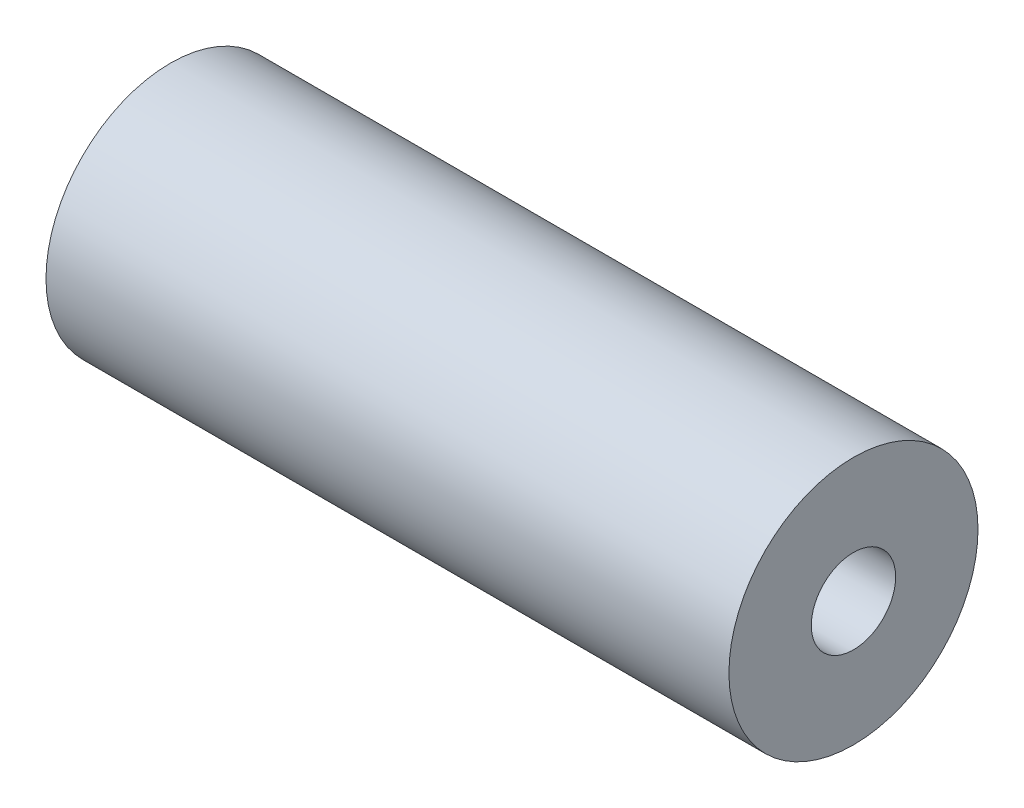
ISO-10303-21;
HEADER;
FILE_DESCRIPTION(('STEP AP214'),'2;1');
FILE_NAME('part.step','',(''),(''),'','','');
FILE_SCHEMA(('AUTOMOTIVE_DESIGN { 1 0 10303 214 1 1 1 1 }'));
ENDSEC;
DATA;
#1=APPLICATION_CONTEXT('core data for automotive mechanical design processes');
#2=APPLICATION_PROTOCOL_DEFINITION('international standard','automotive_design',2000,#1);
#3=PRODUCT_CONTEXT('',#1,'mechanical');
#4=PRODUCT('Part','Part','',(#3));
#5=PRODUCT_RELATED_PRODUCT_CATEGORY('part','',(#4));
#6=PRODUCT_DEFINITION_FORMATION('','',#4);
#7=PRODUCT_DEFINITION_CONTEXT('part definition',#1,'design');
#8=PRODUCT_DEFINITION('design','',#6,#7);
#9=PRODUCT_DEFINITION_SHAPE('','',#8);
#10=(LENGTH_UNIT() NAMED_UNIT(*) SI_UNIT(.MILLI.,.METRE.));
#11=(NAMED_UNIT(*) PLANE_ANGLE_UNIT() SI_UNIT($,.RADIAN.));
#12=(NAMED_UNIT(*) SI_UNIT($,.STERADIAN.) SOLID_ANGLE_UNIT());
#13=UNCERTAINTY_MEASURE_WITH_UNIT(LENGTH_MEASURE(1.E-05),#10,'distance_accuracy_value','');
#14=(GEOMETRIC_REPRESENTATION_CONTEXT(3) GLOBAL_UNCERTAINTY_ASSIGNED_CONTEXT((#13)) GLOBAL_UNIT_ASSIGNED_CONTEXT((#10,
#11,#12)) REPRESENTATION_CONTEXT('',''));
#15=CARTESIAN_POINT('',(0.,0.,0.));
#16=DIRECTION('',(0.,0.,1.));
#17=DIRECTION('',(1.,0.,0.));
#18=AXIS2_PLACEMENT_3D('',#15,#16,#17);
#19=CARTESIAN_POINT('',(170.,0.,0.));
#20=DIRECTION('',(-1.,0.,0.));
#21=DIRECTION('',(0.,0.,1.));
#22=AXIS2_PLACEMENT_3D('',#19,#20,#21);
#23=CYLINDRICAL_SURFACE('',#22,31.);
#24=DIRECTION('',(-1.,0.,0.));
#25=VECTOR('',#24,1.);
#26=CARTESIAN_POINT('',(170.,-30.5941170815567,5.));
#27=LINE('',#26,#25);
#28=CARTESIAN_POINT('',(25.,-30.5941170815567,5.));
#29=VERTEX_POINT('',#28);
#30=CARTESIAN_POINT('',(83.,-30.5941170815567,5.));
#31=VERTEX_POINT('',#30);
#32=EDGE_CURVE('E11',#29,#31,#27,.F.);
#33=ORIENTED_EDGE('',*,*,#32,.T.);
#34=CARTESIAN_POINT('',(83.,-30.5941170815567,5.));
#35=CARTESIAN_POINT('',(83.1396522558734,-30.5941071741538,5.00001612842654));
#36=CARTESIAN_POINT('',(83.2793009600637,-30.5950729461344,4.99414987062401));
#37=CARTESIAN_POINT('',(83.5575810930809,-30.5988840397781,4.97077002056007));
#38=CARTESIAN_POINT('',(83.6962126189883,-30.6017291796498,4.9532575548369));
#39=CARTESIAN_POINT('',(83.9713056099153,-30.6092225947377,4.90673143890542));
#40=CARTESIAN_POINT('',(84.1077695440122,-30.6138686382505,4.87773202250646));
#41=CARTESIAN_POINT('',(84.3777350960057,-30.6248261006454,4.80845745966161));
#42=CARTESIAN_POINT('',(84.5112367190193,-30.6311375166504,4.76818233269464));
#43=CARTESIAN_POINT('',(84.7743464730473,-30.6452450210902,4.67665451545295));
#44=CARTESIAN_POINT('',(84.9039544466453,-30.653041169458,4.62540138202717));
#45=CARTESIAN_POINT('',(85.1584202633789,-30.6698981622747,4.51227401809612));
#46=CARTESIAN_POINT('',(85.2832763301259,-30.6789594738789,4.45039586240544));
#47=CARTESIAN_POINT('',(85.5272851759284,-30.6980842966025,4.31650199254374));
#48=CARTESIAN_POINT('',(85.6464401134908,-30.7081474239066,4.24449015644547));
#49=CARTESIAN_POINT('',(85.8783321763252,-30.7290002056173,4.09078975178582));
#50=CARTESIAN_POINT('',(85.9910668930725,-30.7397901294087,4.00909758662821));
#51=CARTESIAN_POINT('',(86.2101605525618,-30.7618783120002,3.83595049095398));
#52=CARTESIAN_POINT('',(86.3164629632366,-30.7731798769397,3.74442444129199));
#53=CARTESIAN_POINT('',(86.5210367880178,-30.7958984241521,3.55273919634224));
#54=CARTESIAN_POINT('',(86.6193052144903,-30.8073154476036,3.45257681761761));
#55=CARTESIAN_POINT('',(86.8070701202042,-30.8299383086468,3.24435900328871));
#56=CARTESIAN_POINT('',(86.8965684692976,-30.8411441908421,3.13630525880012));
#57=CARTESIAN_POINT('',(87.0662251169312,-30.8630378529609,2.91298546869822));
#58=CARTESIAN_POINT('',(87.1463799591285,-30.8737254403087,2.79771677821926));
#59=CARTESIAN_POINT('',(87.2971362555281,-30.89433237188,2.56017781398533));
#60=CARTESIAN_POINT('',(87.3676857961783,-30.9042474264433,2.43787421057488));
#61=CARTESIAN_POINT('',(87.4982463027265,-30.9229694928127,2.1876255484355));
#62=CARTESIAN_POINT('',(87.5582533352148,-30.9317760907077,2.05967840628214));
#63=CARTESIAN_POINT('',(87.6672243163081,-30.9480222115328,1.79915070466793));
#64=CARTESIAN_POINT('',(87.7161934932441,-30.955462381392,1.66657237339253));
#65=CARTESIAN_POINT('',(87.8027703240675,-30.9687709376887,1.39762864005682));
#66=CARTESIAN_POINT('',(87.8403738378524,-30.9746387512853,1.26126187771009));
#67=CARTESIAN_POINT('',(87.9036156829223,-30.9845843869765,0.986997476265643));
#68=CARTESIAN_POINT('',(87.9293586312806,-30.9886778401677,0.849124652404992));
#69=CARTESIAN_POINT('',(87.9691941763295,-30.9950405680555,0.571668207031232));
#70=CARTESIAN_POINT('',(87.9832827246491,-30.9973092088623,0.432084008112663));
#71=CARTESIAN_POINT('',(88.0078075274266,-31.0012516355408,0.0122764438117));
#72=CARTESIAN_POINT('',(88.0005740372597,-31.0000733893785,-0.269310931648517));
#73=CARTESIAN_POINT('',(87.9546843911017,-30.9927218491337,-0.685954716283433));
#74=CARTESIAN_POINT('',(87.9337072543593,-30.9893660829688,-0.823318809281628));
#75=CARTESIAN_POINT('',(87.8804182036781,-30.9809256585637,-1.09578033561988));
#76=CARTESIAN_POINT('',(87.8481102287201,-30.9758416011547,-1.23087853957988));
#77=CARTESIAN_POINT('',(87.7723795716887,-30.9640794838408,-1.49788968331604));
#78=CARTESIAN_POINT('',(87.7289528558429,-30.9574008454968,-1.62980144803576));
#79=CARTESIAN_POINT('',(87.6313301481413,-30.9426387176189,-1.88944592761933));
#80=CARTESIAN_POINT('',(87.5771379661488,-30.9345557252079,-2.0171801023466));
#81=CARTESIAN_POINT('',(87.458087146784,-30.9171644836089,-2.26822624899323));
#82=CARTESIAN_POINT('',(87.3931796714044,-30.907850665269,-2.39151466872192));
#83=CARTESIAN_POINT('',(87.2533688539311,-30.8882883840228,-2.63214919359668));
#84=CARTESIAN_POINT('',(87.1784690746595,-30.8780402546618,-2.74949739628896));
#85=CARTESIAN_POINT('',(87.0191499156105,-30.8568846837756,-2.97754746937996));
#86=CARTESIAN_POINT('',(86.9347268653318,-30.8459769887943,-3.08824675175789));
#87=CARTESIAN_POINT('',(86.7569992501345,-30.8238101896404,-3.3021639836244));
#88=CARTESIAN_POINT('',(86.6636978572199,-30.8125512119311,-3.40538458201177));
#89=CARTESIAN_POINT('',(86.4676888419347,-30.7898568177399,-3.60484553899268));
#90=CARTESIAN_POINT('',(86.3648844694461,-30.7784208718382,-3.70099078808451));
#91=CARTESIAN_POINT('',(86.1515597123142,-30.7558301171178,-3.88425510301695));
#92=CARTESIAN_POINT('',(86.0410421425075,-30.74467520774,-3.97137743312738));
#93=CARTESIAN_POINT('',(85.812943509841,-30.7229516214796,-4.13607913416195));
#94=CARTESIAN_POINT('',(85.695357803399,-30.7123833389604,-4.21365212714727));
#95=CARTESIAN_POINT('',(85.4540496973847,-30.6921474190116,-4.35860559143728));
#96=CARTESIAN_POINT('',(85.3303296342819,-30.6824794426485,-4.42598990442832));
#97=CARTESIAN_POINT('',(85.0773260640176,-30.6643006578887,-4.5502326486069));
#98=CARTESIAN_POINT('',(84.9480320869567,-30.6557921642928,-4.60707010342665));
#99=CARTESIAN_POINT('',(84.6850741188298,-30.6402065689048,-4.70961059847246));
#100=CARTESIAN_POINT('',(84.5514118344641,-30.6331289156687,-4.75531792962886));
#101=CARTESIAN_POINT('',(84.2807748241907,-30.6206161228882,-4.83523569096362));
#102=CARTESIAN_POINT('',(84.1438037596333,-30.6151792502412,-4.86945825643488));
#103=CARTESIAN_POINT('',(83.8674558112168,-30.6061010782083,-4.92619562411105));
#104=CARTESIAN_POINT('',(83.7280801167089,-30.6024589160833,-4.94871605195974));
#105=CARTESIAN_POINT('',(83.4903811542104,-30.5978911593996,-4.97686586978178));
#106=CARTESIAN_POINT('',(83.3924176243321,-30.5964767966981,-4.98554586641818));
#107=CARTESIAN_POINT('',(83.1963058777745,-30.5945895087695,-4.99710932381166));
#108=CARTESIAN_POINT('',(83.098158250939,-30.5941150003154,-5.00000253275545));
#109=CARTESIAN_POINT('',(83.,-30.5941170815567,-5.));
#110=B_SPLINE_CURVE_WITH_KNOTS('',3,(#34,#35,#36,#37,#38,#39,#40,#41,#42,#43,#44,#45,#46,#47,
#48,#49,#50,#51,#52,#53,#54,#55,#56,#57,#58,#59,#60,#61,#62,#63,#64,#65,#66,#67,#68,#69,#70,#71,
#72,#73,#74,#75,#76,#77,#78,#79,#80,#81,#82,#83,#84,#85,#86,#87,#88,#89,#90,#91,#92,#93,#94,#95,
#96,#97,#98,#99,#100,#101,#102,#103,#104,#105,#106,#107,#108,#109),.UNSPECIFIED.,.F.,.F.,(4,2,2,
2,2,2,2,2,2,2,2,2,2,2,2,2,2,2,2,2,2,2,2,2,2,2,2,2,2,2,2,2,2,2,2,2,2,4),(0.,0.418825005902232,
0.837609504734256,1.25587669094738,1.67414315460394,2.09242650567747,2.51086471629068,
2.92914322747177,3.34757763456954,3.76927285908017,4.19112419466083,4.61288539149567,
5.03480211409566,5.45891558789914,5.88318696394561,6.30725694991344,6.731481223674,
7.15188836904748,7.57244148935725,8.41260740659341,8.82923045173311,9.24570880800171,
9.6623384732381,10.078820956426,10.4972569207358,10.9155440857049,11.3339930231952,
11.7522930169523,12.1754564133796,12.5984661809758,13.0217569585344,13.4448877323007,
13.8688512451272,14.2926510501282,14.7160016297662,15.1391485006318,15.4340557485135,
15.7284657878412),.UNSPECIFIED.);
#111=CARTESIAN_POINT('',(83.,-30.5941170815567,-5.));
#112=VERTEX_POINT('',#111);
#113=EDGE_CURVE('E63',#31,#112,#110,.T.);
#114=ORIENTED_EDGE('',*,*,#113,.T.);
#115=DIRECTION('',(-1.,0.,0.));
#116=VECTOR('',#115,1.);
#117=CARTESIAN_POINT('',(170.,-30.5941170815567,-5.));
#118=LINE('',#117,#116);
#119=CARTESIAN_POINT('',(25.,-30.5941170815567,-5.));
#120=VERTEX_POINT('',#119);
#121=EDGE_CURVE('E164',#112,#120,#118,.T.);
#122=ORIENTED_EDGE('',*,*,#121,.T.);
#123=CARTESIAN_POINT('',(25.,-30.5941170815567,-5.));
#124=CARTESIAN_POINT('',(24.8603477441266,-30.5941071741538,-5.00001612842654));
#125=CARTESIAN_POINT('',(24.7206990399363,-30.5950729461344,-4.99414987062401));
#126=CARTESIAN_POINT('',(24.4424189069191,-30.5988840397781,-4.97077002056007));
#127=CARTESIAN_POINT('',(24.3037873810117,-30.6017291796498,-4.9532575548369));
#128=CARTESIAN_POINT('',(24.0286943900847,-30.6092225947377,-4.90673143890542));
#129=CARTESIAN_POINT('',(23.8922304559878,-30.6138686382505,-4.87773202250646));
#130=CARTESIAN_POINT('',(23.6222649039943,-30.6248261006454,-4.80845745966162));
#131=CARTESIAN_POINT('',(23.4887632809807,-30.6311375166504,-4.76818233269464));
#132=CARTESIAN_POINT('',(23.2256535269527,-30.6452450210902,-4.67665451545295));
#133=CARTESIAN_POINT('',(23.0960455533547,-30.653041169458,-4.62540138202718));
#134=CARTESIAN_POINT('',(22.8415797366211,-30.6698981622747,-4.51227401809613));
#135=CARTESIAN_POINT('',(22.7167236698741,-30.6789594738789,-4.45039586240545));
#136=CARTESIAN_POINT('',(22.4727148240716,-30.6980842966025,-4.31650199254375));
#137=CARTESIAN_POINT('',(22.3535598865092,-30.7081474239066,-4.24449015644547));
#138=CARTESIAN_POINT('',(22.1216678236748,-30.7290002056173,-4.09078975178583));
#139=CARTESIAN_POINT('',(22.0089331069275,-30.7397901294087,-4.00909758662822));
#140=CARTESIAN_POINT('',(21.7898394474382,-30.7618783120002,-3.83595049095399));
#141=CARTESIAN_POINT('',(21.6835370367634,-30.7731798769397,-3.744424441292));
#142=CARTESIAN_POINT('',(21.4789632119822,-30.7958984241521,-3.55273919634223));
#143=CARTESIAN_POINT('',(21.3806947855097,-30.8073154476036,-3.45257681761761));
#144=CARTESIAN_POINT('',(21.1929298797958,-30.8299383086468,-3.24435900328872));
#145=CARTESIAN_POINT('',(21.1034315307024,-30.8411441908421,-3.13630525880012));
#146=CARTESIAN_POINT('',(20.9337748830688,-30.8630378529609,-2.91298546869822));
#147=CARTESIAN_POINT('',(20.8536200408715,-30.8737254403087,-2.79771677821926));
#148=CARTESIAN_POINT('',(20.7028637444719,-30.89433237188,-2.56017781398534));
#149=CARTESIAN_POINT('',(20.6323142038217,-30.9042474264433,-2.43787421057489));
#150=CARTESIAN_POINT('',(20.5017536972735,-30.9229694928127,-2.1876255484355));
#151=CARTESIAN_POINT('',(20.4417466647852,-30.9317760907077,-2.05967840628214));
#152=CARTESIAN_POINT('',(20.3327756836919,-30.9480222115328,-1.79915070466794));
#153=CARTESIAN_POINT('',(20.2838065067559,-30.955462381392,-1.66657237339254));
#154=CARTESIAN_POINT('',(20.1972296759325,-30.9687709376887,-1.39762864005684));
#155=CARTESIAN_POINT('',(20.1596261621476,-30.9746387512853,-1.26126187771011));
#156=CARTESIAN_POINT('',(20.0963843170777,-30.9845843869765,-0.98699747626566));
#157=CARTESIAN_POINT('',(20.0706413687194,-30.9886778401677,-0.849124652405009));
#158=CARTESIAN_POINT('',(20.0308058236705,-30.9950405680555,-0.571668207031248));
#159=CARTESIAN_POINT('',(20.0167172753509,-30.9973092088623,-0.43208400811268));
#160=CARTESIAN_POINT('',(19.9921924725734,-31.0012516355408,-0.012276443811718));
#161=CARTESIAN_POINT('',(19.9994259627403,-31.0000733893785,0.269310931648499));
#162=CARTESIAN_POINT('',(20.0453156088983,-30.9927218491337,0.685954716283416));
#163=CARTESIAN_POINT('',(20.0662927456407,-30.9893660829688,0.823318809281611));
#164=CARTESIAN_POINT('',(20.1195817963219,-30.9809256585637,1.09578033561987));
#165=CARTESIAN_POINT('',(20.1518897712799,-30.9758416011547,1.23087853957987));
#166=CARTESIAN_POINT('',(20.2276204283113,-30.9640794838408,1.49788968331603));
#167=CARTESIAN_POINT('',(20.2710471441571,-30.9574008454968,1.62980144803575));
#168=CARTESIAN_POINT('',(20.3686698518587,-30.9426387176189,1.88944592761932));
#169=CARTESIAN_POINT('',(20.4228620338512,-30.9345557252079,2.01718010234659));
#170=CARTESIAN_POINT('',(20.541912853216,-30.9171644836089,2.26822624899321));
#171=CARTESIAN_POINT('',(20.6068203285956,-30.907850665269,2.3915146687219));
#172=CARTESIAN_POINT('',(20.7466311460689,-30.8882883840229,2.63214919359666));
#173=CARTESIAN_POINT('',(20.8215309253405,-30.8780402546618,2.74949739628894));
#174=CARTESIAN_POINT('',(20.9808500843895,-30.8568846837756,2.97754746937994));
#175=CARTESIAN_POINT('',(21.0652731346682,-30.8459769887943,3.08824675175786));
#176=CARTESIAN_POINT('',(21.2430007498654,-30.8238101896404,3.30216398362437));
#177=CARTESIAN_POINT('',(21.3363021427801,-30.8125512119311,3.40538458201175));
#178=CARTESIAN_POINT('',(21.5323111580653,-30.7898568177399,3.60484553899267));
#179=CARTESIAN_POINT('',(21.6351155305539,-30.7784208718382,3.7009907880845));
#180=CARTESIAN_POINT('',(21.8484402876858,-30.7558301171178,3.88425510301694));
#181=CARTESIAN_POINT('',(21.9589578574925,-30.74467520774,3.97137743312737));
#182=CARTESIAN_POINT('',(22.1870564901589,-30.7229516214796,4.13607913416194));
#183=CARTESIAN_POINT('',(22.304642196601,-30.7123833389604,4.21365212714726));
#184=CARTESIAN_POINT('',(22.5459503026152,-30.6921474190116,4.35860559143728));
#185=CARTESIAN_POINT('',(22.669670365718,-30.6824794426485,4.42598990442831));
#186=CARTESIAN_POINT('',(22.9226739359823,-30.6643006578887,4.55023264860689));
#187=CARTESIAN_POINT('',(23.0519679130433,-30.6557921642928,4.60707010342664));
#188=CARTESIAN_POINT('',(23.3149258811702,-30.6402065689048,4.70961059847245));
#189=CARTESIAN_POINT('',(23.4485881655359,-30.6331289156687,4.75531792962885));
#190=CARTESIAN_POINT('',(23.7192251758093,-30.6206161228882,4.83523569096361));
#191=CARTESIAN_POINT('',(23.8561962403666,-30.6151792502412,4.86945825643487));
#192=CARTESIAN_POINT('',(24.1325441887831,-30.6061010782083,4.92619562411105));
#193=CARTESIAN_POINT('',(24.271919883291,-30.6024589160833,4.94871605195974));
#194=CARTESIAN_POINT('',(24.5096188457896,-30.5978911593996,4.97686586978178));
#195=CARTESIAN_POINT('',(24.6075823756679,-30.5964767966981,4.98554586641818));
#196=CARTESIAN_POINT('',(24.8036941222255,-30.5945895087695,4.99710932381167));
#197=CARTESIAN_POINT('',(24.901841749061,-30.5941150003153,5.00000253275545));
#198=CARTESIAN_POINT('',(25.,-30.5941170815567,5.));
#199=B_SPLINE_CURVE_WITH_KNOTS('',3,(#123,#124,#125,#126,#127,#128,#129,#130,#131,#132,#133,
#134,#135,#136,#137,#138,#139,#140,#141,#142,#143,#144,#145,#146,#147,#148,#149,#150,#151,#152,
#153,#154,#155,#156,#157,#158,#159,#160,#161,#162,#163,#164,#165,#166,#167,#168,#169,#170,#171,
#172,#173,#174,#175,#176,#177,#178,#179,#180,#181,#182,#183,#184,#185,#186,#187,#188,#189,#190,
#191,#192,#193,#194,#195,#196,#197,#198),.UNSPECIFIED.,.F.,.F.,(4,2,2,2,2,2,2,2,2,2,2,2,2,2,2,2,
2,2,2,2,2,2,2,2,2,2,2,2,2,2,2,2,2,2,2,2,2,4),(0.,0.418825005902225,0.837609504734256,
1.25587669094738,1.67414315460394,2.09242650567748,2.51086471629068,2.92914322747178,
3.34757763456954,3.76927285908018,4.19112419466084,4.61288539149568,5.03480211409567,
5.45891558789915,5.88318696394561,6.30725694991344,6.731481223674,7.15188836904748,
7.57244148935725,8.41260740659341,8.8292304517331,9.24570880800171,9.6623384732381,
10.078820956426,10.4972569207358,10.9155440857049,11.3339930231952,11.7522930169523,
12.1754564133796,12.5984661809758,13.0217569585344,13.4448877323007,13.8688512451272,
14.2926510501281,14.7160016297662,15.1391485006318,15.4340557485135,15.7284657878412),.UNSPECIFIED.);
#200=EDGE_CURVE('E56',#120,#29,#199,.T.);
#201=ORIENTED_EDGE('',*,*,#200,.T.);
#202=EDGE_LOOP('',(#33,#114,#122,#201));
#203=FACE_BOUND('',#202,.T.);
#204=CARTESIAN_POINT('',(170.,0.,0.));
#205=DIRECTION('',(1.,0.,0.));
#206=DIRECTION('',(0.,0.,-1.));
#207=AXIS2_PLACEMENT_3D('',#204,#205,#206);
#208=CIRCLE('',#207,31.);
#209=CARTESIAN_POINT('',(170.,0.,-31.));
#210=VERTEX_POINT('',#209);
#211=EDGE_CURVE('E150',#210,#210,#208,.T.);
#212=ORIENTED_EDGE('',*,*,#211,.F.);
#213=EDGE_LOOP('',(#212));
#214=FACE_BOUND('',#213,.T.);
#215=CARTESIAN_POINT('',(0.,0.,0.));
#216=DIRECTION('',(1.,0.,0.));
#217=DIRECTION('',(0.,0.,-1.));
#218=AXIS2_PLACEMENT_3D('',#215,#216,#217);
#219=CIRCLE('',#218,31.);
#220=CARTESIAN_POINT('',(0.,0.,-31.));
#221=VERTEX_POINT('',#220);
#222=EDGE_CURVE('E149',#221,#221,#219,.T.);
#223=ORIENTED_EDGE('',*,*,#222,.T.);
#224=EDGE_LOOP('',(#223));
#225=FACE_BOUND('',#224,.T.);
#226=ADVANCED_FACE('F47',(#203,#214,#225),#23,.T.);
#227=CARTESIAN_POINT('',(170.,0.,0.));
#228=DIRECTION('',(1.,0.,0.));
#229=DIRECTION('',(0.,0.,-1.));
#230=AXIS2_PLACEMENT_3D('',#227,#228,#229);
#231=PLANE('',#230);
#232=CARTESIAN_POINT('',(170.,0.,0.));
#233=DIRECTION('',(1.,0.,0.));
#234=DIRECTION('',(0.,0.,-1.));
#235=AXIS2_PLACEMENT_3D('',#232,#233,#234);
#236=CIRCLE('',#235,10.5);
#237=CARTESIAN_POINT('',(170.,0.,-10.5));
#238=VERTEX_POINT('',#237);
#239=EDGE_CURVE('E145',#238,#238,#236,.T.);
#240=ORIENTED_EDGE('',*,*,#239,.F.);
#241=EDGE_LOOP('',(#240));
#242=FACE_BOUND('',#241,.T.);
#243=ORIENTED_EDGE('',*,*,#211,.T.);
#244=EDGE_LOOP('',(#243));
#245=FACE_BOUND('',#244,.T.);
#246=ADVANCED_FACE('F193',(#242,#245),#231,.T.);
#247=CARTESIAN_POINT('',(0.,0.,0.));
#248=DIRECTION('',(1.,0.,0.));
#249=DIRECTION('',(0.,0.,-1.));
#250=AXIS2_PLACEMENT_3D('',#247,#248,#249);
#251=PLANE('',#250);
#252=CARTESIAN_POINT('',(0.,0.,0.));
#253=DIRECTION('',(-1.,0.,0.));
#254=DIRECTION('',(0.,0.,1.));
#255=AXIS2_PLACEMENT_3D('',#252,#253,#254);
#256=CIRCLE('',#255,13.8);
#257=CARTESIAN_POINT('',(0.,0.,13.8));
#258=VERTEX_POINT('',#257);
#259=EDGE_CURVE('E120',#258,#258,#256,.T.);
#260=ORIENTED_EDGE('',*,*,#259,.F.);
#261=EDGE_LOOP('',(#260));
#262=FACE_BOUND('',#261,.T.);
#263=ORIENTED_EDGE('',*,*,#222,.F.);
#264=EDGE_LOOP('',(#263));
#265=FACE_BOUND('',#264,.T.);
#266=ADVANCED_FACE('F198',(#262,#265),#251,.F.);
#267=CARTESIAN_POINT('',(170.,0.,0.));
#268=DIRECTION('',(1.,0.,0.));
#269=DIRECTION('',(0.,0.,-1.));
#270=AXIS2_PLACEMENT_3D('',#267,#268,#269);
#271=CYLINDRICAL_SURFACE('',#270,10.5);
#272=CARTESIAN_POINT('',(130.,0.,0.));
#273=DIRECTION('',(1.,0.,0.));
#274=DIRECTION('',(0.,0.,-1.));
#275=AXIS2_PLACEMENT_3D('',#272,#273,#274);
#276=CIRCLE('',#275,10.5);
#277=CARTESIAN_POINT('',(130.,0.,-10.5));
#278=VERTEX_POINT('',#277);
#279=EDGE_CURVE('E138',#278,#278,#276,.F.);
#280=ORIENTED_EDGE('',*,*,#279,.T.);
#281=EDGE_LOOP('',(#280));
#282=FACE_BOUND('',#281,.T.);
#283=ORIENTED_EDGE('',*,*,#239,.T.);
#284=EDGE_LOOP('',(#283));
#285=FACE_BOUND('',#284,.T.);
#286=ADVANCED_FACE('F205',(#282,#285),#271,.F.);
#287=CARTESIAN_POINT('',(130.,0.,0.));
#288=DIRECTION('',(1.,0.,0.));
#289=DIRECTION('',(0.,0.,-1.));
#290=AXIS2_PLACEMENT_3D('',#287,#288,#289);
#291=PLANE('',#290);
#292=CARTESIAN_POINT('',(130.,0.,0.));
#293=DIRECTION('',(1.,0.,0.));
#294=DIRECTION('',(0.,0.,-1.));
#295=AXIS2_PLACEMENT_3D('',#292,#293,#294);
#296=CIRCLE('',#295,15.);
#297=CARTESIAN_POINT('',(130.,0.,-15.));
#298=VERTEX_POINT('',#297);
#299=EDGE_CURVE('E133',#298,#298,#296,.T.);
#300=ORIENTED_EDGE('',*,*,#299,.F.);
#301=EDGE_LOOP('',(#300));
#302=FACE_BOUND('',#301,.T.);
#303=ORIENTED_EDGE('',*,*,#279,.F.);
#304=EDGE_LOOP('',(#303));
#305=FACE_BOUND('',#304,.T.);
#306=ADVANCED_FACE('F212',(#302,#305),#291,.F.);
#307=CARTESIAN_POINT('',(76.,0.,0.));
#308=DIRECTION('',(1.,0.,0.));
#309=DIRECTION('',(0.,0.,-1.));
#310=AXIS2_PLACEMENT_3D('',#307,#308,#309);
#311=CYLINDRICAL_SURFACE('',#310,15.);
#312=CARTESIAN_POINT('',(76.,0.,0.));
#313=DIRECTION('',(1.,0.,0.));
#314=DIRECTION('',(0.,0.,-1.));
#315=AXIS2_PLACEMENT_3D('',#312,#313,#314);
#316=CIRCLE('',#315,15.);
#317=CARTESIAN_POINT('',(76.,0.,-15.));
#318=VERTEX_POINT('',#317);
#319=EDGE_CURVE('E134',#318,#318,#316,.T.);
#320=ORIENTED_EDGE('',*,*,#319,.F.);
#321=EDGE_LOOP('',(#320));
#322=FACE_BOUND('',#321,.T.);
#323=ORIENTED_EDGE('',*,*,#299,.T.);
#324=EDGE_LOOP('',(#323));
#325=FACE_BOUND('',#324,.T.);
#326=ADVANCED_FACE('F214',(#322,#325),#311,.F.);
#327=CARTESIAN_POINT('',(76.,0.,0.));
#328=DIRECTION('',(1.,0.,0.));
#329=DIRECTION('',(0.,0.,-1.));
#330=AXIS2_PLACEMENT_3D('',#327,#328,#329);
#331=PLANE('',#330);
#332=CARTESIAN_POINT('',(76.,0.,0.));
#333=DIRECTION('',(-1.,0.,0.));
#334=DIRECTION('',(0.,0.,1.));
#335=AXIS2_PLACEMENT_3D('',#332,#333,#334);
#336=CIRCLE('',#335,10.);
#337=CARTESIAN_POINT('',(76.,0.,10.));
#338=VERTEX_POINT('',#337);
#339=EDGE_CURVE('E129',#338,#338,#336,.T.);
#340=ORIENTED_EDGE('',*,*,#339,.T.);
#341=EDGE_LOOP('',(#340));
#342=FACE_BOUND('',#341,.T.);
#343=ORIENTED_EDGE('',*,*,#319,.T.);
#344=EDGE_LOOP('',(#343));
#345=FACE_BOUND('',#344,.T.);
#346=ADVANCED_FACE('F217',(#342,#345),#331,.T.);
#347=CARTESIAN_POINT('',(76.,0.,0.));
#348=DIRECTION('',(-1.,0.,0.));
#349=DIRECTION('',(0.,0.,1.));
#350=AXIS2_PLACEMENT_3D('',#347,#348,#349);
#351=CONICAL_SURFACE('',#350,10.,0.0499583957219426);
#352=ORIENTED_EDGE('',*,*,#259,.T.);
#353=EDGE_LOOP('',(#352));
#354=FACE_BOUND('',#353,.T.);
#355=ORIENTED_EDGE('',*,*,#339,.F.);
#356=EDGE_LOOP('',(#355));
#357=FACE_BOUND('',#356,.T.);
#358=ADVANCED_FACE('F177',(#354,#357),#351,.F.);
#359=CARTESIAN_POINT('',(25.,-31.,0.));
#360=DIRECTION('',(0.,1.,0.));
#361=DIRECTION('',(0.,0.,1.));
#362=AXIS2_PLACEMENT_3D('',#359,#360,#361);
#363=CYLINDRICAL_SURFACE('',#362,5.);
#364=DIRECTION('',(0.,1.,0.));
#365=VECTOR('',#364,1.);
#366=CARTESIAN_POINT('',(25.,-31.,-5.));
#367=LINE('',#366,#365);
#368=CARTESIAN_POINT('',(25.,-25.,-5.));
#369=VERTEX_POINT('',#368);
#370=EDGE_CURVE('E110',#120,#369,#367,.T.);
#371=ORIENTED_EDGE('',*,*,#370,.T.);
#372=CARTESIAN_POINT('',(25.,-25.,0.));
#373=DIRECTION('',(0.,1.,0.));
#374=DIRECTION('',(0.,0.,1.));
#375=AXIS2_PLACEMENT_3D('',#372,#373,#374);
#376=CIRCLE('',#375,5.);
#377=CARTESIAN_POINT('',(25.,-25.,5.));
#378=VERTEX_POINT('',#377);
#379=EDGE_CURVE('E103',#369,#378,#376,.T.);
#380=ORIENTED_EDGE('',*,*,#379,.T.);
#381=DIRECTION('',(0.,1.,0.));
#382=VECTOR('',#381,1.);
#383=CARTESIAN_POINT('',(25.,-31.,5.));
#384=LINE('',#383,#382);
#385=EDGE_CURVE('E89',#29,#378,#384,.T.);
#386=ORIENTED_EDGE('',*,*,#385,.F.);
#387=ORIENTED_EDGE('',*,*,#200,.F.);
#388=EDGE_LOOP('',(#371,#380,#386,#387));
#389=FACE_BOUND('',#388,.T.);
#390=ADVANCED_FACE('F109',(#389),#363,.F.);
#391=CARTESIAN_POINT('',(25.,-31.,-5.));
#392=DIRECTION('',(0.,0.,-1.));
#393=DIRECTION('',(-1.,0.,0.));
#394=AXIS2_PLACEMENT_3D('',#391,#392,#393);
#395=PLANE('',#394);
#396=DIRECTION('',(0.,1.,0.));
#397=VECTOR('',#396,1.);
#398=CARTESIAN_POINT('',(83.,-31.,-5.));
#399=LINE('',#398,#397);
#400=CARTESIAN_POINT('',(83.,-25.,-5.));
#401=VERTEX_POINT('',#400);
#402=EDGE_CURVE('E121',#112,#401,#399,.T.);
#403=ORIENTED_EDGE('',*,*,#402,.T.);
#404=DIRECTION('',(-1.,0.,0.));
#405=VECTOR('',#404,1.);
#406=CARTESIAN_POINT('',(25.,-25.,-5.));
#407=LINE('',#406,#405);
#408=EDGE_CURVE('E96',#401,#369,#407,.T.);
#409=ORIENTED_EDGE('',*,*,#408,.T.);
#410=ORIENTED_EDGE('',*,*,#370,.F.);
#411=ORIENTED_EDGE('',*,*,#121,.F.);
#412=EDGE_LOOP('',(#403,#409,#410,#411));
#413=FACE_BOUND('',#412,.T.);
#414=ADVANCED_FACE('F170',(#413),#395,.F.);
#415=CARTESIAN_POINT('',(83.,-31.,0.));
#416=DIRECTION('',(0.,1.,0.));
#417=DIRECTION('',(0.,0.,1.));
#418=AXIS2_PLACEMENT_3D('',#415,#416,#417);
#419=CYLINDRICAL_SURFACE('',#418,5.);
#420=DIRECTION('',(0.,1.,0.));
#421=VECTOR('',#420,1.);
#422=CARTESIAN_POINT('',(83.,-31.,5.));
#423=LINE('',#422,#421);
#424=CARTESIAN_POINT('',(83.,-25.,5.));
#425=VERTEX_POINT('',#424);
#426=EDGE_CURVE('E95',#31,#425,#423,.T.);
#427=ORIENTED_EDGE('',*,*,#426,.T.);
#428=CARTESIAN_POINT('',(83.,-25.,0.));
#429=DIRECTION('',(0.,1.,0.));
#430=DIRECTION('',(0.,0.,1.));
#431=AXIS2_PLACEMENT_3D('',#428,#429,#430);
#432=CIRCLE('',#431,5.);
#433=EDGE_CURVE('E106',#425,#401,#432,.T.);
#434=ORIENTED_EDGE('',*,*,#433,.T.);
#435=ORIENTED_EDGE('',*,*,#402,.F.);
#436=ORIENTED_EDGE('',*,*,#113,.F.);
#437=EDGE_LOOP('',(#427,#434,#435,#436));
#438=FACE_BOUND('',#437,.T.);
#439=ADVANCED_FACE('F165',(#438),#419,.F.);
#440=CARTESIAN_POINT('',(25.,-31.,5.));
#441=DIRECTION('',(0.,0.,1.));
#442=DIRECTION('',(1.,0.,0.));
#443=AXIS2_PLACEMENT_3D('',#440,#441,#442);
#444=PLANE('',#443);
#445=ORIENTED_EDGE('',*,*,#385,.T.);
#446=DIRECTION('',(1.,0.,0.));
#447=VECTOR('',#446,1.);
#448=CARTESIAN_POINT('',(25.,-25.,5.));
#449=LINE('',#448,#447);
#450=EDGE_CURVE('E92',#378,#425,#449,.T.);
#451=ORIENTED_EDGE('',*,*,#450,.T.);
#452=ORIENTED_EDGE('',*,*,#426,.F.);
#453=ORIENTED_EDGE('',*,*,#32,.F.);
#454=EDGE_LOOP('',(#445,#451,#452,#453));
#455=FACE_BOUND('',#454,.T.);
#456=ADVANCED_FACE('F91',(#455),#444,.F.);
#457=CARTESIAN_POINT('',(25.,-25.,0.));
#458=DIRECTION('',(0.,1.,0.));
#459=DIRECTION('',(0.,0.,1.));
#460=AXIS2_PLACEMENT_3D('',#457,#458,#459);
#461=PLANE('',#460);
#462=ORIENTED_EDGE('',*,*,#379,.F.);
#463=ORIENTED_EDGE('',*,*,#408,.F.);
#464=ORIENTED_EDGE('',*,*,#433,.F.);
#465=ORIENTED_EDGE('',*,*,#450,.F.);
#466=EDGE_LOOP('',(#462,#463,#464,#465));
#467=FACE_BOUND('',#466,.T.);
#468=ADVANCED_FACE('F101',(#467),#461,.F.);
#469=CLOSED_SHELL('',(#226,#246,#266,#286,#306,#326,#346,#358,#390,#414,#439,#456,#468));
#470=MANIFOLD_SOLID_BREP('B2',#469);
#471=ADVANCED_BREP_SHAPE_REPRESENTATION('',(#18,#470),#14);
#472=SHAPE_DEFINITION_REPRESENTATION(#9,#471);
ENDSEC;
END-ISO-10303-21;
